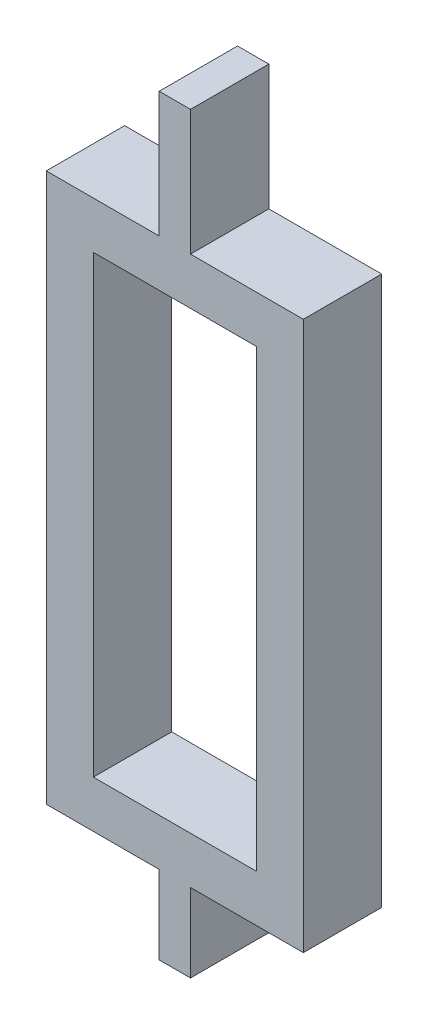
ISO-10303-21;
HEADER;
FILE_DESCRIPTION(('STEP AP214'),'2;1');
FILE_NAME('part.step','',(''),(''),'','','');
FILE_SCHEMA(('AUTOMOTIVE_DESIGN { 1 0 10303 214 1 1 1 1 }'));
ENDSEC;
DATA;
#1=APPLICATION_CONTEXT('core data for automotive mechanical design processes');
#2=APPLICATION_PROTOCOL_DEFINITION('international standard','automotive_design',2000,#1);
#3=PRODUCT_CONTEXT('',#1,'mechanical');
#4=PRODUCT('Part','Part','',(#3));
#5=PRODUCT_RELATED_PRODUCT_CATEGORY('part','',(#4));
#6=PRODUCT_DEFINITION_FORMATION('','',#4);
#7=PRODUCT_DEFINITION_CONTEXT('part definition',#1,'design');
#8=PRODUCT_DEFINITION('design','',#6,#7);
#9=PRODUCT_DEFINITION_SHAPE('','',#8);
#10=(LENGTH_UNIT() NAMED_UNIT(*) SI_UNIT(.MILLI.,.METRE.));
#11=(NAMED_UNIT(*) PLANE_ANGLE_UNIT() SI_UNIT($,.RADIAN.));
#12=(NAMED_UNIT(*) SI_UNIT($,.STERADIAN.) SOLID_ANGLE_UNIT());
#13=UNCERTAINTY_MEASURE_WITH_UNIT(LENGTH_MEASURE(1.E-05),#10,'distance_accuracy_value','');
#14=(GEOMETRIC_REPRESENTATION_CONTEXT(3) GLOBAL_UNCERTAINTY_ASSIGNED_CONTEXT((#13)) GLOBAL_UNIT_ASSIGNED_CONTEXT((#10,
#11,#12)) REPRESENTATION_CONTEXT('',''));
#15=CARTESIAN_POINT('',(0.,0.,0.));
#16=DIRECTION('',(0.,0.,1.));
#17=DIRECTION('',(1.,0.,0.));
#18=AXIS2_PLACEMENT_3D('',#15,#16,#17);
#19=CARTESIAN_POINT('',(-10.414,0.0220030941736176,6.35));
#20=DIRECTION('',(0.,1.,0.));
#21=DIRECTION('',(-1.,0.,0.));
#22=AXIS2_PLACEMENT_3D('',#19,#20,#21);
#23=PLANE('',#22);
#24=DIRECTION('',(1.,0.,0.));
#25=VECTOR('',#24,1.);
#26=CARTESIAN_POINT('',(-10.414,0.0220030941736176,0.));
#27=LINE('',#26,#25);
#28=CARTESIAN_POINT('',(-10.414,0.0220030941736176,0.));
#29=VERTEX_POINT('',#28);
#30=CARTESIAN_POINT('',(-1.27,0.0220030941736213,0.));
#31=VERTEX_POINT('',#30);
#32=EDGE_CURVE('E183',#29,#31,#27,.T.);
#33=ORIENTED_EDGE('',*,*,#32,.T.);
#34=DIRECTION('',(0.,0.,-1.));
#35=VECTOR('',#34,1.);
#36=CARTESIAN_POINT('',(-1.27,0.0220030941736213,6.35));
#37=LINE('',#36,#35);
#38=CARTESIAN_POINT('',(-1.27,0.0220030941736213,6.35));
#39=VERTEX_POINT('',#38);
#40=EDGE_CURVE('E11',#39,#31,#37,.T.);
#41=ORIENTED_EDGE('',*,*,#40,.F.);
#42=DIRECTION('',(1.,0.,0.));
#43=VECTOR('',#42,1.);
#44=CARTESIAN_POINT('',(-10.414,0.0220030941736176,6.35));
#45=LINE('',#44,#43);
#46=CARTESIAN_POINT('',(-10.414,0.0220030941736176,6.35));
#47=VERTEX_POINT('',#46);
#48=EDGE_CURVE('E187',#47,#39,#45,.T.);
#49=ORIENTED_EDGE('',*,*,#48,.F.);
#50=DIRECTION('',(0.,0.,-1.));
#51=VECTOR('',#50,1.);
#52=CARTESIAN_POINT('',(-10.414,0.0220030941736176,6.35));
#53=LINE('',#52,#51);
#54=EDGE_CURVE('E213',#47,#29,#53,.T.);
#55=ORIENTED_EDGE('',*,*,#54,.T.);
#56=EDGE_LOOP('',(#33,#41,#49,#55));
#57=FACE_BOUND('',#56,.T.);
#58=ADVANCED_FACE('F38',(#57),#23,.F.);
#59=CARTESIAN_POINT('',(-1.27,0.0220030941736213,6.35));
#60=DIRECTION('',(1.,0.,0.));
#61=DIRECTION('',(0.,1.,0.));
#62=AXIS2_PLACEMENT_3D('',#59,#60,#61);
#63=PLANE('',#62);
#64=DIRECTION('',(0.,-1.,0.));
#65=VECTOR('',#64,1.);
#66=CARTESIAN_POINT('',(-1.27,0.0220030941736213,0.));
#67=LINE('',#66,#65);
#68=CARTESIAN_POINT('',(-1.27,-6.32799690582638,0.));
#69=VERTEX_POINT('',#68);
#70=EDGE_CURVE('E216',#31,#69,#67,.T.);
#71=ORIENTED_EDGE('',*,*,#70,.T.);
#72=DIRECTION('',(0.,0.,-1.));
#73=VECTOR('',#72,1.);
#74=CARTESIAN_POINT('',(-1.27,-6.32799690582638,6.35));
#75=LINE('',#74,#73);
#76=CARTESIAN_POINT('',(-1.27,-6.32799690582638,6.35));
#77=VERTEX_POINT('',#76);
#78=EDGE_CURVE('E45',#77,#69,#75,.T.);
#79=ORIENTED_EDGE('',*,*,#78,.F.);
#80=DIRECTION('',(0.,-1.,0.));
#81=VECTOR('',#80,1.);
#82=CARTESIAN_POINT('',(-1.27,0.0220030941736213,6.35));
#83=LINE('',#82,#81);
#84=EDGE_CURVE('E190',#39,#77,#83,.T.);
#85=ORIENTED_EDGE('',*,*,#84,.F.);
#86=ORIENTED_EDGE('',*,*,#40,.T.);
#87=EDGE_LOOP('',(#71,#79,#85,#86));
#88=FACE_BOUND('',#87,.T.);
#89=ADVANCED_FACE('F291',(#88),#63,.F.);
#90=CARTESIAN_POINT('',(-1.27,-6.32799690582638,6.35));
#91=DIRECTION('',(0.,1.,0.));
#92=DIRECTION('',(-1.,0.,0.));
#93=AXIS2_PLACEMENT_3D('',#90,#91,#92);
#94=PLANE('',#93);
#95=DIRECTION('',(1.,0.,0.));
#96=VECTOR('',#95,1.);
#97=CARTESIAN_POINT('',(-1.27,-6.32799690582638,0.));
#98=LINE('',#97,#96);
#99=CARTESIAN_POINT('',(1.27,-6.32799690582638,0.));
#100=VERTEX_POINT('',#99);
#101=EDGE_CURVE('E218',#69,#100,#98,.T.);
#102=ORIENTED_EDGE('',*,*,#101,.T.);
#103=DIRECTION('',(0.,0.,-1.));
#104=VECTOR('',#103,1.);
#105=CARTESIAN_POINT('',(1.27,-6.32799690582638,6.35));
#106=LINE('',#105,#104);
#107=CARTESIAN_POINT('',(1.27,-6.32799690582638,6.35));
#108=VERTEX_POINT('',#107);
#109=EDGE_CURVE('E263',#108,#100,#106,.T.);
#110=ORIENTED_EDGE('',*,*,#109,.F.);
#111=DIRECTION('',(1.,0.,0.));
#112=VECTOR('',#111,1.);
#113=CARTESIAN_POINT('',(-1.27,-6.32799690582638,6.35));
#114=LINE('',#113,#112);
#115=EDGE_CURVE('E193',#77,#108,#114,.T.);
#116=ORIENTED_EDGE('',*,*,#115,.F.);
#117=ORIENTED_EDGE('',*,*,#78,.T.);
#118=EDGE_LOOP('',(#102,#110,#116,#117));
#119=FACE_BOUND('',#118,.T.);
#120=ADVANCED_FACE('F270',(#119),#94,.F.);
#121=CARTESIAN_POINT('',(1.27,0.0220030941736213,6.35));
#122=DIRECTION('',(-1.,0.,0.));
#123=DIRECTION('',(0.,-1.,0.));
#124=AXIS2_PLACEMENT_3D('',#121,#122,#123);
#125=PLANE('',#124);
#126=DIRECTION('',(0.,1.,0.));
#127=VECTOR('',#126,1.);
#128=CARTESIAN_POINT('',(1.27,0.0220030941736213,0.));
#129=LINE('',#128,#127);
#130=CARTESIAN_POINT('',(1.27,0.0220030941736213,0.));
#131=VERTEX_POINT('',#130);
#132=EDGE_CURVE('E220',#100,#131,#129,.T.);
#133=ORIENTED_EDGE('',*,*,#132,.T.);
#134=DIRECTION('',(0.,0.,-1.));
#135=VECTOR('',#134,1.);
#136=CARTESIAN_POINT('',(1.27,0.0220030941736213,6.35));
#137=LINE('',#136,#135);
#138=CARTESIAN_POINT('',(1.27,0.0220030941736213,6.35));
#139=VERTEX_POINT('',#138);
#140=EDGE_CURVE('E260',#139,#131,#137,.T.);
#141=ORIENTED_EDGE('',*,*,#140,.F.);
#142=DIRECTION('',(0.,1.,0.));
#143=VECTOR('',#142,1.);
#144=CARTESIAN_POINT('',(1.27,0.0220030941736213,6.35));
#145=LINE('',#144,#143);
#146=EDGE_CURVE('E195',#108,#139,#145,.T.);
#147=ORIENTED_EDGE('',*,*,#146,.F.);
#148=ORIENTED_EDGE('',*,*,#109,.T.);
#149=EDGE_LOOP('',(#133,#141,#147,#148));
#150=FACE_BOUND('',#149,.T.);
#151=ADVANCED_FACE('F279',(#150),#125,.F.);
#152=CARTESIAN_POINT('',(10.414,0.0220030941736176,6.35));
#153=DIRECTION('',(0.,1.,0.));
#154=DIRECTION('',(-1.,0.,0.));
#155=AXIS2_PLACEMENT_3D('',#152,#153,#154);
#156=PLANE('',#155);
#157=DIRECTION('',(1.,0.,0.));
#158=VECTOR('',#157,1.);
#159=CARTESIAN_POINT('',(10.414,0.0220030941736176,0.));
#160=LINE('',#159,#158);
#161=CARTESIAN_POINT('',(10.414,0.0220030941736176,0.));
#162=VERTEX_POINT('',#161);
#163=EDGE_CURVE('E222',#131,#162,#160,.T.);
#164=ORIENTED_EDGE('',*,*,#163,.T.);
#165=DIRECTION('',(0.,0.,-1.));
#166=VECTOR('',#165,1.);
#167=CARTESIAN_POINT('',(10.414,0.0220030941736176,6.35));
#168=LINE('',#167,#166);
#169=CARTESIAN_POINT('',(10.414,0.0220030941736176,6.35));
#170=VERTEX_POINT('',#169);
#171=EDGE_CURVE('E257',#170,#162,#168,.T.);
#172=ORIENTED_EDGE('',*,*,#171,.F.);
#173=DIRECTION('',(1.,0.,0.));
#174=VECTOR('',#173,1.);
#175=CARTESIAN_POINT('',(10.414,0.0220030941736176,6.35));
#176=LINE('',#175,#174);
#177=EDGE_CURVE('E197',#139,#170,#176,.T.);
#178=ORIENTED_EDGE('',*,*,#177,.F.);
#179=ORIENTED_EDGE('',*,*,#140,.T.);
#180=EDGE_LOOP('',(#164,#172,#178,#179));
#181=FACE_BOUND('',#180,.T.);
#182=ADVANCED_FACE('F283',(#181),#156,.F.);
#183=CARTESIAN_POINT('',(10.414,0.0220030941736176,6.35));
#184=DIRECTION('',(-1.,0.,0.));
#185=DIRECTION('',(0.,0.,1.));
#186=AXIS2_PLACEMENT_3D('',#183,#184,#185);
#187=PLANE('',#186);
#188=DIRECTION('',(0.,1.,0.));
#189=VECTOR('',#188,1.);
#190=CARTESIAN_POINT('',(10.414,0.0220030941736176,0.));
#191=LINE('',#190,#189);
#192=CARTESIAN_POINT('',(10.414,44.4720030941736,0.));
#193=VERTEX_POINT('',#192);
#194=EDGE_CURVE('E224',#162,#193,#191,.T.);
#195=ORIENTED_EDGE('',*,*,#194,.T.);
#196=DIRECTION('',(0.,0.,-1.));
#197=VECTOR('',#196,1.);
#198=CARTESIAN_POINT('',(10.414,44.4720030941736,6.35));
#199=LINE('',#198,#197);
#200=CARTESIAN_POINT('',(10.414,44.4720030941736,6.35));
#201=VERTEX_POINT('',#200);
#202=EDGE_CURVE('E254',#201,#193,#199,.T.);
#203=ORIENTED_EDGE('',*,*,#202,.F.);
#204=DIRECTION('',(0.,1.,0.));
#205=VECTOR('',#204,1.);
#206=CARTESIAN_POINT('',(10.414,0.0220030941736176,6.35));
#207=LINE('',#206,#205);
#208=EDGE_CURVE('E199',#170,#201,#207,.T.);
#209=ORIENTED_EDGE('',*,*,#208,.F.);
#210=ORIENTED_EDGE('',*,*,#171,.T.);
#211=EDGE_LOOP('',(#195,#203,#209,#210));
#212=FACE_BOUND('',#211,.T.);
#213=ADVANCED_FACE('F324',(#212),#187,.F.);
#214=CARTESIAN_POINT('',(10.414,44.4720030941736,6.35));
#215=DIRECTION('',(0.,-1.,0.));
#216=DIRECTION('',(1.,0.,0.));
#217=AXIS2_PLACEMENT_3D('',#214,#215,#216);
#218=PLANE('',#217);
#219=DIRECTION('',(-1.,0.,0.));
#220=VECTOR('',#219,1.);
#221=CARTESIAN_POINT('',(10.414,44.4720030941736,0.));
#222=LINE('',#221,#220);
#223=CARTESIAN_POINT('',(1.26999999999999,44.4720030941736,0.));
#224=VERTEX_POINT('',#223);
#225=EDGE_CURVE('E226',#193,#224,#222,.T.);
#226=ORIENTED_EDGE('',*,*,#225,.T.);
#227=DIRECTION('',(0.,0.,-1.));
#228=VECTOR('',#227,1.);
#229=CARTESIAN_POINT('',(1.26999999999999,44.4720030941736,6.35));
#230=LINE('',#229,#228);
#231=CARTESIAN_POINT('',(1.26999999999999,44.4720030941736,6.35));
#232=VERTEX_POINT('',#231);
#233=EDGE_CURVE('E251',#232,#224,#230,.T.);
#234=ORIENTED_EDGE('',*,*,#233,.F.);
#235=DIRECTION('',(-1.,0.,0.));
#236=VECTOR('',#235,1.);
#237=CARTESIAN_POINT('',(10.414,44.4720030941736,6.35));
#238=LINE('',#237,#236);
#239=EDGE_CURVE('E201',#201,#232,#238,.T.);
#240=ORIENTED_EDGE('',*,*,#239,.F.);
#241=ORIENTED_EDGE('',*,*,#202,.T.);
#242=EDGE_LOOP('',(#226,#234,#240,#241));
#243=FACE_BOUND('',#242,.T.);
#244=ADVANCED_FACE('F322',(#243),#218,.F.);
#245=CARTESIAN_POINT('',(1.26999999999998,54.6320030941736,6.35));
#246=DIRECTION('',(-1.,0.,0.));
#247=DIRECTION('',(0.,-1.,0.));
#248=AXIS2_PLACEMENT_3D('',#245,#246,#247);
#249=PLANE('',#248);
#250=DIRECTION('',(0.,1.,0.));
#251=VECTOR('',#250,1.);
#252=CARTESIAN_POINT('',(1.26999999999998,54.6320030941736,0.));
#253=LINE('',#252,#251);
#254=CARTESIAN_POINT('',(1.26999999999998,54.6320030941736,0.));
#255=VERTEX_POINT('',#254);
#256=EDGE_CURVE('E228',#224,#255,#253,.T.);
#257=ORIENTED_EDGE('',*,*,#256,.T.);
#258=DIRECTION('',(0.,0.,-1.));
#259=VECTOR('',#258,1.);
#260=CARTESIAN_POINT('',(1.26999999999998,54.6320030941736,6.35));
#261=LINE('',#260,#259);
#262=CARTESIAN_POINT('',(1.26999999999998,54.6320030941736,6.35));
#263=VERTEX_POINT('',#262);
#264=EDGE_CURVE('E248',#263,#255,#261,.T.);
#265=ORIENTED_EDGE('',*,*,#264,.F.);
#266=DIRECTION('',(0.,1.,0.));
#267=VECTOR('',#266,1.);
#268=CARTESIAN_POINT('',(1.26999999999998,54.6320030941736,6.35));
#269=LINE('',#268,#267);
#270=EDGE_CURVE('E203',#232,#263,#269,.T.);
#271=ORIENTED_EDGE('',*,*,#270,.F.);
#272=ORIENTED_EDGE('',*,*,#233,.T.);
#273=EDGE_LOOP('',(#257,#265,#271,#272));
#274=FACE_BOUND('',#273,.T.);
#275=ADVANCED_FACE('F318',(#274),#249,.F.);
#276=CARTESIAN_POINT('',(-1.26999999999999,54.6320030941736,6.35));
#277=DIRECTION('',(0.,-1.,0.));
#278=DIRECTION('',(0.,0.,-1.));
#279=AXIS2_PLACEMENT_3D('',#276,#277,#278);
#280=PLANE('',#279);
#281=DIRECTION('',(-1.,0.,0.));
#282=VECTOR('',#281,1.);
#283=CARTESIAN_POINT('',(-1.26999999999999,54.6320030941736,0.));
#284=LINE('',#283,#282);
#285=CARTESIAN_POINT('',(-1.26999999999999,54.6320030941736,0.));
#286=VERTEX_POINT('',#285);
#287=EDGE_CURVE('E230',#255,#286,#284,.T.);
#288=ORIENTED_EDGE('',*,*,#287,.T.);
#289=DIRECTION('',(0.,0.,-1.));
#290=VECTOR('',#289,1.);
#291=CARTESIAN_POINT('',(-1.26999999999999,54.6320030941736,6.35));
#292=LINE('',#291,#290);
#293=CARTESIAN_POINT('',(-1.26999999999999,54.6320030941736,6.35));
#294=VERTEX_POINT('',#293);
#295=EDGE_CURVE('E245',#294,#286,#292,.T.);
#296=ORIENTED_EDGE('',*,*,#295,.F.);
#297=DIRECTION('',(-1.,0.,0.));
#298=VECTOR('',#297,1.);
#299=CARTESIAN_POINT('',(-1.26999999999999,54.6320030941736,6.35));
#300=LINE('',#299,#298);
#301=EDGE_CURVE('E205',#263,#294,#300,.T.);
#302=ORIENTED_EDGE('',*,*,#301,.F.);
#303=ORIENTED_EDGE('',*,*,#264,.T.);
#304=EDGE_LOOP('',(#288,#296,#302,#303));
#305=FACE_BOUND('',#304,.T.);
#306=ADVANCED_FACE('F313',(#305),#280,.F.);
#307=CARTESIAN_POINT('',(-1.27000000000001,44.4720030941736,6.35));
#308=DIRECTION('',(1.,0.,0.));
#309=DIRECTION('',(0.,1.,0.));
#310=AXIS2_PLACEMENT_3D('',#307,#308,#309);
#311=PLANE('',#310);
#312=DIRECTION('',(0.,-1.,0.));
#313=VECTOR('',#312,1.);
#314=CARTESIAN_POINT('',(-1.27000000000001,44.4720030941736,0.));
#315=LINE('',#314,#313);
#316=CARTESIAN_POINT('',(-1.27000000000001,44.4720030941736,0.));
#317=VERTEX_POINT('',#316);
#318=EDGE_CURVE('E232',#286,#317,#315,.T.);
#319=ORIENTED_EDGE('',*,*,#318,.T.);
#320=DIRECTION('',(0.,0.,-1.));
#321=VECTOR('',#320,1.);
#322=CARTESIAN_POINT('',(-1.27000000000001,44.4720030941736,6.35));
#323=LINE('',#322,#321);
#324=CARTESIAN_POINT('',(-1.27000000000001,44.4720030941736,6.35));
#325=VERTEX_POINT('',#324);
#326=EDGE_CURVE('E242',#325,#317,#323,.T.);
#327=ORIENTED_EDGE('',*,*,#326,.F.);
#328=DIRECTION('',(0.,-1.,0.));
#329=VECTOR('',#328,1.);
#330=CARTESIAN_POINT('',(-1.27000000000001,44.4720030941736,6.35));
#331=LINE('',#330,#329);
#332=EDGE_CURVE('E207',#294,#325,#331,.T.);
#333=ORIENTED_EDGE('',*,*,#332,.F.);
#334=ORIENTED_EDGE('',*,*,#295,.T.);
#335=EDGE_LOOP('',(#319,#327,#333,#334));
#336=FACE_BOUND('',#335,.T.);
#337=ADVANCED_FACE('F307',(#336),#311,.F.);
#338=CARTESIAN_POINT('',(-10.414,44.4720030941736,6.35));
#339=DIRECTION('',(0.,-1.,0.));
#340=DIRECTION('',(0.,0.,-1.));
#341=AXIS2_PLACEMENT_3D('',#338,#339,#340);
#342=PLANE('',#341);
#343=DIRECTION('',(-1.,0.,0.));
#344=VECTOR('',#343,1.);
#345=CARTESIAN_POINT('',(-10.414,44.4720030941736,0.));
#346=LINE('',#345,#344);
#347=CARTESIAN_POINT('',(-10.414,44.4720030941736,0.));
#348=VERTEX_POINT('',#347);
#349=EDGE_CURVE('E234',#317,#348,#346,.T.);
#350=ORIENTED_EDGE('',*,*,#349,.T.);
#351=DIRECTION('',(0.,0.,-1.));
#352=VECTOR('',#351,1.);
#353=CARTESIAN_POINT('',(-10.414,44.4720030941736,6.35));
#354=LINE('',#353,#352);
#355=CARTESIAN_POINT('',(-10.414,44.4720030941736,6.35));
#356=VERTEX_POINT('',#355);
#357=EDGE_CURVE('E239',#356,#348,#354,.T.);
#358=ORIENTED_EDGE('',*,*,#357,.F.);
#359=DIRECTION('',(-1.,0.,0.));
#360=VECTOR('',#359,1.);
#361=CARTESIAN_POINT('',(-10.414,44.4720030941736,6.35));
#362=LINE('',#361,#360);
#363=EDGE_CURVE('E209',#325,#356,#362,.T.);
#364=ORIENTED_EDGE('',*,*,#363,.F.);
#365=ORIENTED_EDGE('',*,*,#326,.T.);
#366=EDGE_LOOP('',(#350,#358,#364,#365));
#367=FACE_BOUND('',#366,.T.);
#368=ADVANCED_FACE('F303',(#367),#342,.F.);
#369=CARTESIAN_POINT('',(-10.414,44.4720030941736,6.35));
#370=DIRECTION('',(1.,0.,0.));
#371=DIRECTION('',(0.,0.,-1.));
#372=AXIS2_PLACEMENT_3D('',#369,#370,#371);
#373=PLANE('',#372);
#374=DIRECTION('',(0.,-1.,0.));
#375=VECTOR('',#374,1.);
#376=CARTESIAN_POINT('',(-10.414,44.4720030941736,0.));
#377=LINE('',#376,#375);
#378=EDGE_CURVE('E191',#348,#29,#377,.T.);
#379=ORIENTED_EDGE('',*,*,#378,.T.);
#380=ORIENTED_EDGE('',*,*,#54,.F.);
#381=DIRECTION('',(0.,-1.,0.));
#382=VECTOR('',#381,1.);
#383=CARTESIAN_POINT('',(-10.414,44.4720030941736,6.35));
#384=LINE('',#383,#382);
#385=EDGE_CURVE('E211',#356,#47,#384,.T.);
#386=ORIENTED_EDGE('',*,*,#385,.F.);
#387=ORIENTED_EDGE('',*,*,#357,.T.);
#388=EDGE_LOOP('',(#379,#380,#386,#387));
#389=FACE_BOUND('',#388,.T.);
#390=ADVANCED_FACE('F298',(#389),#373,.F.);
#391=CARTESIAN_POINT('',(0.,0.,6.35));
#392=DIRECTION('',(0.,0.,-1.));
#393=DIRECTION('',(-1.,0.,0.));
#394=AXIS2_PLACEMENT_3D('',#391,#392,#393);
#395=PLANE('',#394);
#396=DIRECTION('',(0.,-1.,0.));
#397=VECTOR('',#396,1.);
#398=CARTESIAN_POINT('',(-6.604,40.6620030941736,6.35));
#399=LINE('',#398,#397);
#400=CARTESIAN_POINT('',(-6.604,40.6620030941736,6.35));
#401=VERTEX_POINT('',#400);
#402=CARTESIAN_POINT('',(-6.604,3.83200309417362,6.35));
#403=VERTEX_POINT('',#402);
#404=EDGE_CURVE('E177',#401,#403,#399,.T.);
#405=ORIENTED_EDGE('',*,*,#404,.F.);
#406=DIRECTION('',(-1.,0.,0.));
#407=VECTOR('',#406,1.);
#408=CARTESIAN_POINT('',(6.604,40.6620030941736,6.35));
#409=LINE('',#408,#407);
#410=CARTESIAN_POINT('',(6.604,40.6620030941736,6.35));
#411=VERTEX_POINT('',#410);
#412=EDGE_CURVE('E52',#411,#401,#409,.T.);
#413=ORIENTED_EDGE('',*,*,#412,.F.);
#414=DIRECTION('',(0.,1.,0.));
#415=VECTOR('',#414,1.);
#416=CARTESIAN_POINT('',(6.604,3.83200309417362,6.35));
#417=LINE('',#416,#415);
#418=CARTESIAN_POINT('',(6.604,3.83200309417362,6.35));
#419=VERTEX_POINT('',#418);
#420=EDGE_CURVE('E168',#419,#411,#417,.T.);
#421=ORIENTED_EDGE('',*,*,#420,.F.);
#422=DIRECTION('',(1.,0.,0.));
#423=VECTOR('',#422,1.);
#424=CARTESIAN_POINT('',(-6.604,3.83200309417362,6.35));
#425=LINE('',#424,#423);
#426=EDGE_CURVE('E171',#403,#419,#425,.T.);
#427=ORIENTED_EDGE('',*,*,#426,.F.);
#428=EDGE_LOOP('',(#405,#413,#421,#427));
#429=FACE_BOUND('',#428,.T.);
#430=ORIENTED_EDGE('',*,*,#48,.T.);
#431=ORIENTED_EDGE('',*,*,#84,.T.);
#432=ORIENTED_EDGE('',*,*,#115,.T.);
#433=ORIENTED_EDGE('',*,*,#146,.T.);
#434=ORIENTED_EDGE('',*,*,#177,.T.);
#435=ORIENTED_EDGE('',*,*,#208,.T.);
#436=ORIENTED_EDGE('',*,*,#239,.T.);
#437=ORIENTED_EDGE('',*,*,#270,.T.);
#438=ORIENTED_EDGE('',*,*,#301,.T.);
#439=ORIENTED_EDGE('',*,*,#332,.T.);
#440=ORIENTED_EDGE('',*,*,#363,.T.);
#441=ORIENTED_EDGE('',*,*,#385,.T.);
#442=EDGE_LOOP('',(#430,#431,#432,#433,#434,#435,#436,#437,#438,#439,#440,#441));
#443=FACE_BOUND('',#442,.T.);
#444=ADVANCED_FACE('F287',(#429,#443),#395,.F.);
#445=CARTESIAN_POINT('',(0.,0.,0.));
#446=DIRECTION('',(0.,0.,-1.));
#447=DIRECTION('',(-1.,0.,0.));
#448=AXIS2_PLACEMENT_3D('',#445,#446,#447);
#449=PLANE('',#448);
#450=DIRECTION('',(-1.,0.,0.));
#451=VECTOR('',#450,1.);
#452=CARTESIAN_POINT('',(6.604,40.6620030941736,0.));
#453=LINE('',#452,#451);
#454=CARTESIAN_POINT('',(6.604,40.6620030941736,0.));
#455=VERTEX_POINT('',#454);
#456=CARTESIAN_POINT('',(-6.604,40.6620030941736,0.));
#457=VERTEX_POINT('',#456);
#458=EDGE_CURVE('E152',#455,#457,#453,.T.);
#459=ORIENTED_EDGE('',*,*,#458,.T.);
#460=DIRECTION('',(0.,-1.,0.));
#461=VECTOR('',#460,1.);
#462=CARTESIAN_POINT('',(-6.604,40.6620030941736,0.));
#463=LINE('',#462,#461);
#464=CARTESIAN_POINT('',(-6.604,3.83200309417362,0.));
#465=VERTEX_POINT('',#464);
#466=EDGE_CURVE('E161',#457,#465,#463,.T.);
#467=ORIENTED_EDGE('',*,*,#466,.T.);
#468=DIRECTION('',(1.,0.,0.));
#469=VECTOR('',#468,1.);
#470=CARTESIAN_POINT('',(-6.604,3.83200309417362,0.));
#471=LINE('',#470,#469);
#472=CARTESIAN_POINT('',(6.604,3.83200309417362,0.));
#473=VERTEX_POINT('',#472);
#474=EDGE_CURVE('E60',#465,#473,#471,.T.);
#475=ORIENTED_EDGE('',*,*,#474,.T.);
#476=DIRECTION('',(0.,1.,0.));
#477=VECTOR('',#476,1.);
#478=CARTESIAN_POINT('',(6.604,3.83200309417362,0.));
#479=LINE('',#478,#477);
#480=EDGE_CURVE('E158',#473,#455,#479,.T.);
#481=ORIENTED_EDGE('',*,*,#480,.T.);
#482=EDGE_LOOP('',(#459,#467,#475,#481));
#483=FACE_BOUND('',#482,.T.);
#484=ORIENTED_EDGE('',*,*,#32,.F.);
#485=ORIENTED_EDGE('',*,*,#378,.F.);
#486=ORIENTED_EDGE('',*,*,#349,.F.);
#487=ORIENTED_EDGE('',*,*,#318,.F.);
#488=ORIENTED_EDGE('',*,*,#287,.F.);
#489=ORIENTED_EDGE('',*,*,#256,.F.);
#490=ORIENTED_EDGE('',*,*,#225,.F.);
#491=ORIENTED_EDGE('',*,*,#194,.F.);
#492=ORIENTED_EDGE('',*,*,#163,.F.);
#493=ORIENTED_EDGE('',*,*,#132,.F.);
#494=ORIENTED_EDGE('',*,*,#101,.F.);
#495=ORIENTED_EDGE('',*,*,#70,.F.);
#496=EDGE_LOOP('',(#484,#485,#486,#487,#488,#489,#490,#491,#492,#493,#494,#495));
#497=FACE_BOUND('',#496,.T.);
#498=ADVANCED_FACE('F165',(#483,#497),#449,.T.);
#499=CARTESIAN_POINT('',(6.604,40.6620030941736,0.));
#500=DIRECTION('',(0.,1.,0.));
#501=DIRECTION('',(0.,0.,1.));
#502=AXIS2_PLACEMENT_3D('',#499,#500,#501);
#503=PLANE('',#502);
#504=ORIENTED_EDGE('',*,*,#412,.T.);
#505=DIRECTION('',(0.,0.,1.));
#506=VECTOR('',#505,1.);
#507=CARTESIAN_POINT('',(-6.604,40.6620030941736,0.));
#508=LINE('',#507,#506);
#509=EDGE_CURVE('E148',#457,#401,#508,.T.);
#510=ORIENTED_EDGE('',*,*,#509,.F.);
#511=ORIENTED_EDGE('',*,*,#458,.F.);
#512=DIRECTION('',(0.,0.,1.));
#513=VECTOR('',#512,1.);
#514=CARTESIAN_POINT('',(6.604,40.6620030941736,0.));
#515=LINE('',#514,#513);
#516=EDGE_CURVE('E181',#455,#411,#515,.T.);
#517=ORIENTED_EDGE('',*,*,#516,.T.);
#518=EDGE_LOOP('',(#504,#510,#511,#517));
#519=FACE_BOUND('',#518,.T.);
#520=ADVANCED_FACE('F150',(#519),#503,.F.);
#521=CARTESIAN_POINT('',(6.604,3.83200309417362,0.));
#522=DIRECTION('',(1.,0.,0.));
#523=DIRECTION('',(0.,0.,-1.));
#524=AXIS2_PLACEMENT_3D('',#521,#522,#523);
#525=PLANE('',#524);
#526=ORIENTED_EDGE('',*,*,#420,.T.);
#527=ORIENTED_EDGE('',*,*,#516,.F.);
#528=ORIENTED_EDGE('',*,*,#480,.F.);
#529=DIRECTION('',(0.,0.,1.));
#530=VECTOR('',#529,1.);
#531=CARTESIAN_POINT('',(6.604,3.83200309417362,0.));
#532=LINE('',#531,#530);
#533=EDGE_CURVE('E184',#473,#419,#532,.T.);
#534=ORIENTED_EDGE('',*,*,#533,.T.);
#535=EDGE_LOOP('',(#526,#527,#528,#534));
#536=FACE_BOUND('',#535,.T.);
#537=ADVANCED_FACE('F427',(#536),#525,.F.);
#538=CARTESIAN_POINT('',(-6.604,3.83200309417362,0.));
#539=DIRECTION('',(0.,-1.,0.));
#540=DIRECTION('',(0.,0.,-1.));
#541=AXIS2_PLACEMENT_3D('',#538,#539,#540);
#542=PLANE('',#541);
#543=ORIENTED_EDGE('',*,*,#426,.T.);
#544=ORIENTED_EDGE('',*,*,#533,.F.);
#545=ORIENTED_EDGE('',*,*,#474,.F.);
#546=DIRECTION('',(0.,0.,1.));
#547=VECTOR('',#546,1.);
#548=CARTESIAN_POINT('',(-6.604,3.83200309417362,0.));
#549=LINE('',#548,#547);
#550=EDGE_CURVE('E157',#465,#403,#549,.T.);
#551=ORIENTED_EDGE('',*,*,#550,.T.);
#552=EDGE_LOOP('',(#543,#544,#545,#551));
#553=FACE_BOUND('',#552,.T.);
#554=ADVANCED_FACE('F436',(#553),#542,.F.);
#555=CARTESIAN_POINT('',(-6.604,40.6620030941736,0.));
#556=DIRECTION('',(-1.,0.,0.));
#557=DIRECTION('',(0.,0.,1.));
#558=AXIS2_PLACEMENT_3D('',#555,#556,#557);
#559=PLANE('',#558);
#560=ORIENTED_EDGE('',*,*,#404,.T.);
#561=ORIENTED_EDGE('',*,*,#550,.F.);
#562=ORIENTED_EDGE('',*,*,#466,.F.);
#563=ORIENTED_EDGE('',*,*,#509,.T.);
#564=EDGE_LOOP('',(#560,#561,#562,#563));
#565=FACE_BOUND('',#564,.T.);
#566=ADVANCED_FACE('F162',(#565),#559,.F.);
#567=CLOSED_SHELL('',(#58,#89,#120,#151,#182,#213,#244,#275,#306,#337,#368,#390,#444,#498,#520,
#537,#554,#566));
#568=MANIFOLD_SOLID_BREP('B2',#567);
#569=ADVANCED_BREP_SHAPE_REPRESENTATION('',(#18,#568),#14);
#570=SHAPE_DEFINITION_REPRESENTATION(#9,#569);
ENDSEC;
END-ISO-10303-21;
